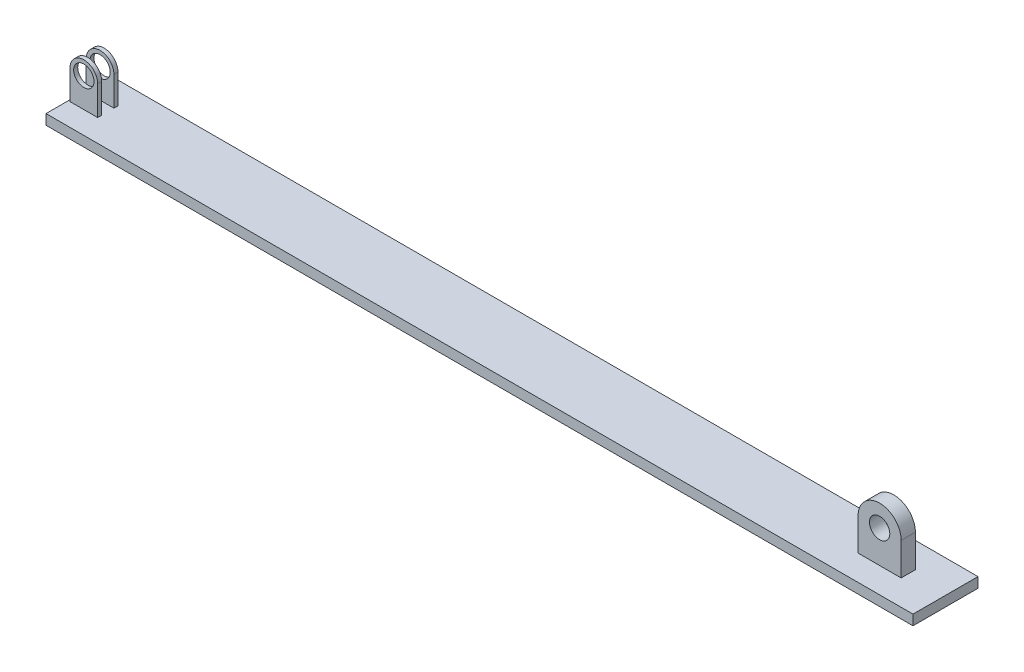
ISO-10303-21;
HEADER;
FILE_DESCRIPTION(('STEP AP214'),'2;1');
FILE_NAME('part.step','',(''),(''),'','','');
FILE_SCHEMA(('AUTOMOTIVE_DESIGN { 1 0 10303 214 1 1 1 1 }'));
ENDSEC;
DATA;
#1=APPLICATION_CONTEXT('core data for automotive mechanical design processes');
#2=APPLICATION_PROTOCOL_DEFINITION('international standard','automotive_design',2000,#1);
#3=PRODUCT_CONTEXT('',#1,'mechanical');
#4=PRODUCT('Part','Part','',(#3));
#5=PRODUCT_RELATED_PRODUCT_CATEGORY('part','',(#4));
#6=PRODUCT_DEFINITION_FORMATION('','',#4);
#7=PRODUCT_DEFINITION_CONTEXT('part definition',#1,'design');
#8=PRODUCT_DEFINITION('design','',#6,#7);
#9=PRODUCT_DEFINITION_SHAPE('','',#8);
#10=(LENGTH_UNIT() NAMED_UNIT(*) SI_UNIT(.MILLI.,.METRE.));
#11=(NAMED_UNIT(*) PLANE_ANGLE_UNIT() SI_UNIT($,.RADIAN.));
#12=(NAMED_UNIT(*) SI_UNIT($,.STERADIAN.) SOLID_ANGLE_UNIT());
#13=UNCERTAINTY_MEASURE_WITH_UNIT(LENGTH_MEASURE(1.E-05),#10,'distance_accuracy_value','');
#14=(GEOMETRIC_REPRESENTATION_CONTEXT(3) GLOBAL_UNCERTAINTY_ASSIGNED_CONTEXT((#13)) GLOBAL_UNIT_ASSIGNED_CONTEXT((#10,
#11,#12)) REPRESENTATION_CONTEXT('',''));
#15=CARTESIAN_POINT('',(0.,0.,0.));
#16=DIRECTION('',(0.,0.,1.));
#17=DIRECTION('',(1.,0.,0.));
#18=AXIS2_PLACEMENT_3D('',#15,#16,#17);
#19=CARTESIAN_POINT('',(0.,2.50000000000002,-16.));
#20=DIRECTION('',(0.,-1.,0.));
#21=DIRECTION('',(1.,0.,0.));
#22=AXIS2_PLACEMENT_3D('',#19,#20,#21);
#23=PLANE('',#22);
#24=DIRECTION('',(0.,0.,-1.));
#25=VECTOR('',#24,1.);
#26=CARTESIAN_POINT('',(14.4298921473095,2.50000000000002,5.));
#27=LINE('',#26,#25);
#28=CARTESIAN_POINT('',(14.4298921473095,2.50000000000002,5.));
#29=VERTEX_POINT('',#28);
#30=CARTESIAN_POINT('',(14.4298921473095,2.50000000000002,3.));
#31=VERTEX_POINT('',#30);
#32=EDGE_CURVE('E250',#29,#31,#27,.T.);
#33=ORIENTED_EDGE('',*,*,#32,.F.);
#34=DIRECTION('',(1.,0.,0.));
#35=VECTOR('',#34,1.);
#36=CARTESIAN_POINT('',(0.803073324079967,2.50000000000002,5.));
#37=LINE('',#36,#35);
#38=CARTESIAN_POINT('',(0.803073324079967,2.50000000000002,5.));
#39=VERTEX_POINT('',#38);
#40=EDGE_CURVE('E216',#39,#29,#37,.T.);
#41=ORIENTED_EDGE('',*,*,#40,.F.);
#42=DIRECTION('',(0.,0.,-1.));
#43=VECTOR('',#42,1.);
#44=CARTESIAN_POINT('',(0.803073324079967,2.50000000000002,5.));
#45=LINE('',#44,#43);
#46=CARTESIAN_POINT('',(0.803073324079967,2.50000000000002,3.));
#47=VERTEX_POINT('',#46);
#48=EDGE_CURVE('E238',#39,#47,#45,.T.);
#49=ORIENTED_EDGE('',*,*,#48,.T.);
#50=DIRECTION('',(-1.,0.,0.));
#51=VECTOR('',#50,1.);
#52=CARTESIAN_POINT('',(55.8620648864741,2.50000000000002,3.));
#53=LINE('',#52,#51);
#54=EDGE_CURVE('E192',#31,#47,#53,.T.);
#55=ORIENTED_EDGE('',*,*,#54,.F.);
#56=EDGE_LOOP('',(#33,#41,#49,#55));
#57=FACE_BOUND('',#56,.T.);
#58=DIRECTION('',(1.,0.,0.));
#59=VECTOR('',#58,1.);
#60=CARTESIAN_POINT('',(0.,2.50000000000002,16.));
#61=LINE('',#60,#59);
#62=CARTESIAN_POINT('',(0.,2.50000000000002,16.));
#63=VERTEX_POINT('',#62);
#64=CARTESIAN_POINT('',(426.72,2.49999999999993,16.));
#65=VERTEX_POINT('',#64);
#66=EDGE_CURVE('E267',#63,#65,#61,.T.);
#67=ORIENTED_EDGE('',*,*,#66,.T.);
#68=DIRECTION('',(0.,0.,1.));
#69=VECTOR('',#68,1.);
#70=CARTESIAN_POINT('',(426.72,2.49999999999993,-16.));
#71=LINE('',#70,#69);
#72=CARTESIAN_POINT('',(426.72,2.49999999999993,-16.));
#73=VERTEX_POINT('',#72);
#74=EDGE_CURVE('E43',#73,#65,#71,.T.);
#75=ORIENTED_EDGE('',*,*,#74,.F.);
#76=DIRECTION('',(1.,0.,0.));
#77=VECTOR('',#76,1.);
#78=CARTESIAN_POINT('',(0.,2.50000000000002,-16.));
#79=LINE('',#78,#77);
#80=CARTESIAN_POINT('',(0.,2.50000000000002,-16.));
#81=VERTEX_POINT('',#80);
#82=EDGE_CURVE('E257',#81,#73,#79,.T.);
#83=ORIENTED_EDGE('',*,*,#82,.F.);
#84=DIRECTION('',(0.,0.,1.));
#85=VECTOR('',#84,1.);
#86=CARTESIAN_POINT('',(0.,2.50000000000002,-16.));
#87=LINE('',#86,#85);
#88=EDGE_CURVE('E11',#81,#63,#87,.T.);
#89=ORIENTED_EDGE('',*,*,#88,.T.);
#90=EDGE_LOOP('',(#67,#75,#83,#89));
#91=FACE_BOUND('',#90,.T.);
#92=CARTESIAN_POINT('',(14.4298921473095,2.50000000000002,-3.));
#93=VERTEX_POINT('',#92);
#94=CARTESIAN_POINT('',(14.4298921473095,2.50000000000002,-5.));
#95=VERTEX_POINT('',#94);
#96=EDGE_CURVE('E249',#93,#95,#27,.T.);
#97=ORIENTED_EDGE('',*,*,#96,.F.);
#98=DIRECTION('',(-1.,0.,0.));
#99=VECTOR('',#98,1.);
#100=CARTESIAN_POINT('',(55.8620648864741,2.50000000000002,-3.));
#101=LINE('',#100,#99);
#102=CARTESIAN_POINT('',(0.803073324079967,2.50000000000002,-3.));
#103=VERTEX_POINT('',#102);
#104=EDGE_CURVE('E199',#93,#103,#101,.T.);
#105=ORIENTED_EDGE('',*,*,#104,.T.);
#106=CARTESIAN_POINT('',(0.803073324079967,2.50000000000002,-5.));
#107=VERTEX_POINT('',#106);
#108=EDGE_CURVE('E227',#103,#107,#45,.T.);
#109=ORIENTED_EDGE('',*,*,#108,.T.);
#110=DIRECTION('',(1.,0.,0.));
#111=VECTOR('',#110,1.);
#112=CARTESIAN_POINT('',(0.803073324079967,2.50000000000002,-5.));
#113=LINE('',#112,#111);
#114=EDGE_CURVE('E213',#107,#95,#113,.T.);
#115=ORIENTED_EDGE('',*,*,#114,.T.);
#116=EDGE_LOOP('',(#97,#105,#109,#115));
#117=FACE_BOUND('',#116,.T.);
#118=DIRECTION('',(0.,0.,-1.));
#119=VECTOR('',#118,1.);
#120=CARTESIAN_POINT('',(408.398633307808,2.50000000000002,3.5));
#121=LINE('',#120,#119);
#122=CARTESIAN_POINT('',(408.398633307808,2.49999999999994,3.5));
#123=VERTEX_POINT('',#122);
#124=CARTESIAN_POINT('',(408.398633307808,2.49999999999994,-3.5));
#125=VERTEX_POINT('',#124);
#126=EDGE_CURVE('E51',#123,#125,#121,.T.);
#127=ORIENTED_EDGE('',*,*,#126,.F.);
#128=DIRECTION('',(1.,0.,0.));
#129=VECTOR('',#128,1.);
#130=CARTESIAN_POINT('',(387.212680742163,2.50000000000002,3.5));
#131=LINE('',#130,#129);
#132=CARTESIAN_POINT('',(387.212680742163,2.50000000000002,3.5));
#133=VERTEX_POINT('',#132);
#134=EDGE_CURVE('E157',#133,#123,#131,.T.);
#135=ORIENTED_EDGE('',*,*,#134,.F.);
#136=DIRECTION('',(0.,0.,-1.));
#137=VECTOR('',#136,1.);
#138=CARTESIAN_POINT('',(387.212680742163,2.50000000000002,3.5));
#139=LINE('',#138,#137);
#140=CARTESIAN_POINT('',(387.212680742163,2.49999999999994,-3.5));
#141=VERTEX_POINT('',#140);
#142=EDGE_CURVE('E173',#133,#141,#139,.T.);
#143=ORIENTED_EDGE('',*,*,#142,.T.);
#144=DIRECTION('',(1.,0.,0.));
#145=VECTOR('',#144,1.);
#146=CARTESIAN_POINT('',(387.212680742163,2.50000000000002,-3.5));
#147=LINE('',#146,#145);
#148=EDGE_CURVE('E56',#141,#125,#147,.T.);
#149=ORIENTED_EDGE('',*,*,#148,.T.);
#150=EDGE_LOOP('',(#127,#135,#143,#149));
#151=FACE_BOUND('',#150,.T.);
#152=ADVANCED_FACE('F34',(#57,#91,#117,#151),#23,.F.);
#153=CARTESIAN_POINT('',(14.4298921473095,2.50000000000002,5.));
#154=DIRECTION('',(-1.,0.,0.));
#155=DIRECTION('',(0.,0.,1.));
#156=AXIS2_PLACEMENT_3D('',#153,#154,#155);
#157=PLANE('',#156);
#158=DIRECTION('',(0.,0.,-1.));
#159=VECTOR('',#158,1.);
#160=CARTESIAN_POINT('',(14.4298921473095,16.9215035060392,5.));
#161=LINE('',#160,#159);
#162=CARTESIAN_POINT('',(14.4298921473095,16.9215035060392,-3.));
#163=VERTEX_POINT('',#162);
#164=CARTESIAN_POINT('',(14.4298921473095,16.9215035060392,-5.));
#165=VERTEX_POINT('',#164);
#166=EDGE_CURVE('E245',#163,#165,#161,.T.);
#167=ORIENTED_EDGE('',*,*,#166,.F.);
#168=DIRECTION('',(0.,1.,0.));
#169=VECTOR('',#168,1.);
#170=CARTESIAN_POINT('',(14.4298921473095,2.50000000000002,-3.));
#171=LINE('',#170,#169);
#172=EDGE_CURVE('E191',#93,#163,#171,.T.);
#173=ORIENTED_EDGE('',*,*,#172,.F.);
#174=ORIENTED_EDGE('',*,*,#96,.T.);
#175=DIRECTION('',(0.,1.,0.));
#176=VECTOR('',#175,1.);
#177=CARTESIAN_POINT('',(14.4298921473095,2.50000000000002,-5.));
#178=LINE('',#177,#176);
#179=EDGE_CURVE('E230',#95,#165,#178,.T.);
#180=ORIENTED_EDGE('',*,*,#179,.T.);
#181=EDGE_LOOP('',(#167,#173,#174,#180));
#182=FACE_BOUND('',#181,.T.);
#183=ADVANCED_FACE('F311',(#182),#157,.F.);
#184=CARTESIAN_POINT('',(7.61648273569473,16.9215035060392,5.));
#185=DIRECTION('',(0.,0.,-1.));
#186=DIRECTION('',(-1.,0.,0.));
#187=AXIS2_PLACEMENT_3D('',#184,#185,#186);
#188=CYLINDRICAL_SURFACE('',#187,6.81340941161476);
#189=DIRECTION('',(0.,0.,-1.));
#190=VECTOR('',#189,1.);
#191=CARTESIAN_POINT('',(0.803073324079967,16.9215035060392,5.));
#192=LINE('',#191,#190);
#193=CARTESIAN_POINT('',(0.803073324079967,16.9215035060392,-3.));
#194=VERTEX_POINT('',#193);
#195=CARTESIAN_POINT('',(0.803073324079967,16.9215035060392,-5.));
#196=VERTEX_POINT('',#195);
#197=EDGE_CURVE('E241',#194,#196,#192,.T.);
#198=ORIENTED_EDGE('',*,*,#197,.F.);
#199=CARTESIAN_POINT('',(7.61648273569473,16.9215035060392,-3.));
#200=DIRECTION('',(0.,0.,-1.));
#201=DIRECTION('',(0.,1.,0.));
#202=AXIS2_PLACEMENT_3D('',#199,#200,#201);
#203=CIRCLE('',#202,6.81340941161476);
#204=EDGE_CURVE('E205',#194,#163,#203,.T.);
#205=ORIENTED_EDGE('',*,*,#204,.T.);
#206=ORIENTED_EDGE('',*,*,#166,.T.);
#207=CARTESIAN_POINT('',(7.61648273569473,16.9215035060392,-5.));
#208=DIRECTION('',(0.,0.,1.));
#209=DIRECTION('',(-1.,0.,0.));
#210=AXIS2_PLACEMENT_3D('',#207,#208,#209);
#211=CIRCLE('',#210,6.81340941161476);
#212=EDGE_CURVE('E233',#165,#196,#211,.T.);
#213=ORIENTED_EDGE('',*,*,#212,.T.);
#214=EDGE_LOOP('',(#198,#205,#206,#213));
#215=FACE_BOUND('',#214,.T.);
#216=ADVANCED_FACE('F316',(#215),#188,.T.);
#217=CARTESIAN_POINT('',(0.803073324079967,2.50000000000002,5.));
#218=DIRECTION('',(1.,0.,0.));
#219=DIRECTION('',(0.,0.,-1.));
#220=AXIS2_PLACEMENT_3D('',#217,#218,#219);
#221=PLANE('',#220);
#222=ORIENTED_EDGE('',*,*,#108,.F.);
#223=DIRECTION('',(0.,-1.,0.));
#224=VECTOR('',#223,1.);
#225=CARTESIAN_POINT('',(0.803073324079967,2.50000000000002,-3.));
#226=LINE('',#225,#224);
#227=EDGE_CURVE('E188',#194,#103,#226,.T.);
#228=ORIENTED_EDGE('',*,*,#227,.F.);
#229=ORIENTED_EDGE('',*,*,#197,.T.);
#230=DIRECTION('',(0.,-1.,0.));
#231=VECTOR('',#230,1.);
#232=CARTESIAN_POINT('',(0.803073324079967,2.50000000000002,-5.));
#233=LINE('',#232,#231);
#234=EDGE_CURVE('E220',#196,#107,#233,.T.);
#235=ORIENTED_EDGE('',*,*,#234,.T.);
#236=EDGE_LOOP('',(#222,#228,#229,#235));
#237=FACE_BOUND('',#236,.T.);
#238=ADVANCED_FACE('F340',(#237),#221,.F.);
#239=CARTESIAN_POINT('',(7.61648273569473,16.9215035060392,5.));
#240=DIRECTION('',(0.,0.,-1.));
#241=DIRECTION('',(-1.,0.,0.));
#242=AXIS2_PLACEMENT_3D('',#239,#240,#241);
#243=CYLINDRICAL_SURFACE('',#242,5.);
#244=CARTESIAN_POINT('',(7.61648273569473,16.9215035060392,-3.));
#245=DIRECTION('',(0.,0.,-1.));
#246=DIRECTION('',(0.,1.,0.));
#247=AXIS2_PLACEMENT_3D('',#244,#245,#246);
#248=CIRCLE('',#247,5.);
#249=CARTESIAN_POINT('',(7.61648273569473,21.9215035060392,-3.));
#250=VERTEX_POINT('',#249);
#251=EDGE_CURVE('E38',#250,#250,#248,.T.);
#252=ORIENTED_EDGE('',*,*,#251,.F.);
#253=EDGE_LOOP('',(#252));
#254=FACE_BOUND('',#253,.T.);
#255=CARTESIAN_POINT('',(7.61648273569473,16.9215035060392,-5.));
#256=DIRECTION('',(0.,0.,1.));
#257=DIRECTION('',(1.,0.,0.));
#258=AXIS2_PLACEMENT_3D('',#255,#256,#257);
#259=CIRCLE('',#258,5.);
#260=CARTESIAN_POINT('',(12.6164827356947,16.9215035060392,-5.));
#261=VERTEX_POINT('',#260);
#262=EDGE_CURVE('E208',#261,#261,#259,.T.);
#263=ORIENTED_EDGE('',*,*,#262,.F.);
#264=EDGE_LOOP('',(#263));
#265=FACE_BOUND('',#264,.T.);
#266=ADVANCED_FACE('F291',(#254,#265),#243,.F.);
#267=CARTESIAN_POINT('',(0.,-2.49999999999998,-16.));
#268=DIRECTION('',(1.,0.,0.));
#269=DIRECTION('',(0.,1.,0.));
#270=AXIS2_PLACEMENT_3D('',#267,#268,#269);
#271=PLANE('',#270);
#272=DIRECTION('',(0.,1.,0.));
#273=VECTOR('',#272,1.);
#274=CARTESIAN_POINT('',(0.,-2.49999999999998,16.));
#275=LINE('',#274,#273);
#276=CARTESIAN_POINT('',(0.,-2.49999999999998,16.));
#277=VERTEX_POINT('',#276);
#278=EDGE_CURVE('E253',#277,#63,#275,.T.);
#279=ORIENTED_EDGE('',*,*,#278,.T.);
#280=ORIENTED_EDGE('',*,*,#88,.F.);
#281=DIRECTION('',(0.,1.,0.));
#282=VECTOR('',#281,1.);
#283=CARTESIAN_POINT('',(0.,-2.49999999999998,-16.));
#284=LINE('',#283,#282);
#285=CARTESIAN_POINT('',(0.,-2.49999999999998,-16.));
#286=VERTEX_POINT('',#285);
#287=EDGE_CURVE('E254',#286,#81,#284,.T.);
#288=ORIENTED_EDGE('',*,*,#287,.F.);
#289=DIRECTION('',(0.,0.,1.));
#290=VECTOR('',#289,1.);
#291=CARTESIAN_POINT('',(0.,-2.49999999999998,-16.));
#292=LINE('',#291,#290);
#293=EDGE_CURVE('E264',#286,#277,#292,.T.);
#294=ORIENTED_EDGE('',*,*,#293,.T.);
#295=EDGE_LOOP('',(#279,#280,#288,#294));
#296=FACE_BOUND('',#295,.T.);
#297=ADVANCED_FACE('F36',(#296),#271,.F.);
#298=CARTESIAN_POINT('',(426.72,-2.49999999999996,-16.));
#299=DIRECTION('',(-1.,0.,0.));
#300=DIRECTION('',(0.,0.,1.));
#301=AXIS2_PLACEMENT_3D('',#298,#299,#300);
#302=PLANE('',#301);
#303=DIRECTION('',(0.,-1.,0.));
#304=VECTOR('',#303,1.);
#305=CARTESIAN_POINT('',(426.72,-2.49999999999996,16.));
#306=LINE('',#305,#304);
#307=CARTESIAN_POINT('',(426.72,-2.49999999999996,16.));
#308=VERTEX_POINT('',#307);
#309=EDGE_CURVE('E270',#65,#308,#306,.T.);
#310=ORIENTED_EDGE('',*,*,#309,.T.);
#311=DIRECTION('',(0.,0.,1.));
#312=VECTOR('',#311,1.);
#313=CARTESIAN_POINT('',(426.72,-2.49999999999996,-16.));
#314=LINE('',#313,#312);
#315=CARTESIAN_POINT('',(426.72,-2.49999999999996,-16.));
#316=VERTEX_POINT('',#315);
#317=EDGE_CURVE('E275',#316,#308,#314,.T.);
#318=ORIENTED_EDGE('',*,*,#317,.F.);
#319=DIRECTION('',(0.,-1.,0.));
#320=VECTOR('',#319,1.);
#321=CARTESIAN_POINT('',(426.72,-2.49999999999996,-16.));
#322=LINE('',#321,#320);
#323=EDGE_CURVE('E260',#73,#316,#322,.T.);
#324=ORIENTED_EDGE('',*,*,#323,.F.);
#325=ORIENTED_EDGE('',*,*,#74,.T.);
#326=EDGE_LOOP('',(#310,#318,#324,#325));
#327=FACE_BOUND('',#326,.T.);
#328=ADVANCED_FACE('F321',(#327),#302,.F.);
#329=CARTESIAN_POINT('',(0.,-2.49999999999998,-16.));
#330=DIRECTION('',(0.,1.,0.));
#331=DIRECTION('',(-1.,0.,0.));
#332=AXIS2_PLACEMENT_3D('',#329,#330,#331);
#333=PLANE('',#332);
#334=DIRECTION('',(-1.,0.,0.));
#335=VECTOR('',#334,1.);
#336=CARTESIAN_POINT('',(0.,-2.49999999999998,16.));
#337=LINE('',#336,#335);
#338=EDGE_CURVE('E258',#308,#277,#337,.T.);
#339=ORIENTED_EDGE('',*,*,#338,.T.);
#340=ORIENTED_EDGE('',*,*,#293,.F.);
#341=DIRECTION('',(-1.,0.,0.));
#342=VECTOR('',#341,1.);
#343=CARTESIAN_POINT('',(0.,-2.49999999999998,-16.));
#344=LINE('',#343,#342);
#345=EDGE_CURVE('E262',#316,#286,#344,.T.);
#346=ORIENTED_EDGE('',*,*,#345,.F.);
#347=ORIENTED_EDGE('',*,*,#317,.T.);
#348=EDGE_LOOP('',(#339,#340,#346,#347));
#349=FACE_BOUND('',#348,.T.);
#350=ADVANCED_FACE('F324',(#349),#333,.F.);
#351=CARTESIAN_POINT('',(0.,2.50000000000002,-16.));
#352=DIRECTION('',(0.,0.,-1.));
#353=DIRECTION('',(-1.,0.,0.));
#354=AXIS2_PLACEMENT_3D('',#351,#352,#353);
#355=PLANE('',#354);
#356=ORIENTED_EDGE('',*,*,#287,.T.);
#357=ORIENTED_EDGE('',*,*,#82,.T.);
#358=ORIENTED_EDGE('',*,*,#323,.T.);
#359=ORIENTED_EDGE('',*,*,#345,.T.);
#360=EDGE_LOOP('',(#356,#357,#358,#359));
#361=FACE_BOUND('',#360,.T.);
#362=ADVANCED_FACE('F307',(#361),#355,.T.);
#363=CARTESIAN_POINT('',(0.,2.50000000000002,16.));
#364=DIRECTION('',(0.,0.,-1.));
#365=DIRECTION('',(-1.,0.,0.));
#366=AXIS2_PLACEMENT_3D('',#363,#364,#365);
#367=PLANE('',#366);
#368=ORIENTED_EDGE('',*,*,#278,.F.);
#369=ORIENTED_EDGE('',*,*,#338,.F.);
#370=ORIENTED_EDGE('',*,*,#309,.F.);
#371=ORIENTED_EDGE('',*,*,#66,.F.);
#372=EDGE_LOOP('',(#368,#369,#370,#371));
#373=FACE_BOUND('',#372,.T.);
#374=ADVANCED_FACE('F297',(#373),#367,.F.);
#375=CARTESIAN_POINT('',(7.61648273569473,16.9215035060392,5.));
#376=DIRECTION('',(0.,0.,-1.));
#377=DIRECTION('',(-1.,0.,0.));
#378=AXIS2_PLACEMENT_3D('',#375,#376,#377);
#379=PLANE('',#378);
#380=ORIENTED_EDGE('',*,*,#40,.T.);
#381=DIRECTION('',(0.,1.,0.));
#382=VECTOR('',#381,1.);
#383=CARTESIAN_POINT('',(14.4298921473095,2.50000000000002,5.));
#384=LINE('',#383,#382);
#385=CARTESIAN_POINT('',(14.4298921473095,16.9215035060392,5.));
#386=VERTEX_POINT('',#385);
#387=EDGE_CURVE('E219',#29,#386,#384,.T.);
#388=ORIENTED_EDGE('',*,*,#387,.T.);
#389=CARTESIAN_POINT('',(7.61648273569473,16.9215035060392,5.));
#390=DIRECTION('',(0.,0.,1.));
#391=DIRECTION('',(-1.,0.,0.));
#392=AXIS2_PLACEMENT_3D('',#389,#390,#391);
#393=CIRCLE('',#392,6.81340941161476);
#394=CARTESIAN_POINT('',(0.803073324079967,16.9215035060392,5.));
#395=VERTEX_POINT('',#394);
#396=EDGE_CURVE('E222',#386,#395,#393,.T.);
#397=ORIENTED_EDGE('',*,*,#396,.T.);
#398=DIRECTION('',(0.,-1.,0.));
#399=VECTOR('',#398,1.);
#400=CARTESIAN_POINT('',(0.803073324079967,2.50000000000002,5.));
#401=LINE('',#400,#399);
#402=EDGE_CURVE('E224',#395,#39,#401,.T.);
#403=ORIENTED_EDGE('',*,*,#402,.T.);
#404=EDGE_LOOP('',(#380,#388,#397,#403));
#405=FACE_BOUND('',#404,.T.);
#406=CARTESIAN_POINT('',(7.61648273569473,16.9215035060392,5.));
#407=DIRECTION('',(0.,0.,1.));
#408=DIRECTION('',(1.,0.,0.));
#409=AXIS2_PLACEMENT_3D('',#406,#407,#408);
#410=CIRCLE('',#409,5.);
#411=CARTESIAN_POINT('',(12.6164827356947,16.9215035060392,5.));
#412=VERTEX_POINT('',#411);
#413=EDGE_CURVE('E209',#412,#412,#410,.T.);
#414=ORIENTED_EDGE('',*,*,#413,.F.);
#415=EDGE_LOOP('',(#414));
#416=FACE_BOUND('',#415,.T.);
#417=ADVANCED_FACE('F294',(#405,#416),#379,.F.);
#418=CARTESIAN_POINT('',(7.61648273569473,16.9215035060392,-5.));
#419=DIRECTION('',(0.,0.,-1.));
#420=DIRECTION('',(-1.,0.,0.));
#421=AXIS2_PLACEMENT_3D('',#418,#419,#420);
#422=PLANE('',#421);
#423=ORIENTED_EDGE('',*,*,#114,.F.);
#424=ORIENTED_EDGE('',*,*,#234,.F.);
#425=ORIENTED_EDGE('',*,*,#212,.F.);
#426=ORIENTED_EDGE('',*,*,#179,.F.);
#427=EDGE_LOOP('',(#423,#424,#425,#426));
#428=FACE_BOUND('',#427,.T.);
#429=ORIENTED_EDGE('',*,*,#262,.T.);
#430=EDGE_LOOP('',(#429));
#431=FACE_BOUND('',#430,.T.);
#432=ADVANCED_FACE('F296',(#428,#431),#422,.T.);
#433=ORIENTED_EDGE('',*,*,#32,.T.);
#434=DIRECTION('',(0.,-1.,0.));
#435=VECTOR('',#434,1.);
#436=CARTESIAN_POINT('',(14.4298921473095,2.50000000000002,3.));
#437=LINE('',#436,#435);
#438=CARTESIAN_POINT('',(14.4298921473095,16.9215035060392,3.));
#439=VERTEX_POINT('',#438);
#440=EDGE_CURVE('E189',#439,#31,#437,.T.);
#441=ORIENTED_EDGE('',*,*,#440,.F.);
#442=EDGE_CURVE('E246',#386,#439,#161,.T.);
#443=ORIENTED_EDGE('',*,*,#442,.F.);
#444=ORIENTED_EDGE('',*,*,#387,.F.);
#445=EDGE_LOOP('',(#433,#441,#443,#444));
#446=FACE_BOUND('',#445,.T.);
#447=ADVANCED_FACE('F304',(#446),#157,.F.);
#448=ORIENTED_EDGE('',*,*,#442,.T.);
#449=CARTESIAN_POINT('',(7.61648273569473,16.9215035060392,3.));
#450=DIRECTION('',(0.,0.,1.));
#451=DIRECTION('',(0.,-1.,0.));
#452=AXIS2_PLACEMENT_3D('',#449,#450,#451);
#453=CIRCLE('',#452,6.81340941161476);
#454=CARTESIAN_POINT('',(0.803073324079967,16.9215035060392,3.));
#455=VERTEX_POINT('',#454);
#456=EDGE_CURVE('E202',#439,#455,#453,.T.);
#457=ORIENTED_EDGE('',*,*,#456,.T.);
#458=EDGE_CURVE('E242',#395,#455,#192,.T.);
#459=ORIENTED_EDGE('',*,*,#458,.F.);
#460=ORIENTED_EDGE('',*,*,#396,.F.);
#461=EDGE_LOOP('',(#448,#457,#459,#460));
#462=FACE_BOUND('',#461,.T.);
#463=ADVANCED_FACE('F333',(#462),#188,.T.);
#464=ORIENTED_EDGE('',*,*,#458,.T.);
#465=DIRECTION('',(0.,1.,0.));
#466=VECTOR('',#465,1.);
#467=CARTESIAN_POINT('',(0.803073324079967,2.50000000000002,3.));
#468=LINE('',#467,#466);
#469=EDGE_CURVE('E197',#47,#455,#468,.T.);
#470=ORIENTED_EDGE('',*,*,#469,.F.);
#471=ORIENTED_EDGE('',*,*,#48,.F.);
#472=ORIENTED_EDGE('',*,*,#402,.F.);
#473=EDGE_LOOP('',(#464,#470,#471,#472));
#474=FACE_BOUND('',#473,.T.);
#475=ADVANCED_FACE('F289',(#474),#221,.F.);
#476=CARTESIAN_POINT('',(7.61648273569473,16.9215035060392,3.));
#477=DIRECTION('',(0.,0.,1.));
#478=DIRECTION('',(0.,-1.,0.));
#479=AXIS2_PLACEMENT_3D('',#476,#477,#478);
#480=CIRCLE('',#479,5.);
#481=CARTESIAN_POINT('',(7.61648273569473,11.9215035060392,3.));
#482=VERTEX_POINT('',#481);
#483=EDGE_CURVE('E194',#482,#482,#480,.T.);
#484=ORIENTED_EDGE('',*,*,#483,.F.);
#485=EDGE_LOOP('',(#484));
#486=FACE_BOUND('',#485,.T.);
#487=ORIENTED_EDGE('',*,*,#413,.T.);
#488=EDGE_LOOP('',(#487));
#489=FACE_BOUND('',#488,.T.);
#490=ADVANCED_FACE('F285',(#486,#489),#243,.F.);
#491=CARTESIAN_POINT('',(55.8620648864741,2.50000000000002,-3.));
#492=DIRECTION('',(0.,0.,-1.));
#493=DIRECTION('',(0.,1.,0.));
#494=AXIS2_PLACEMENT_3D('',#491,#492,#493);
#495=PLANE('',#494);
#496=ORIENTED_EDGE('',*,*,#251,.T.);
#497=EDGE_LOOP('',(#496));
#498=FACE_BOUND('',#497,.T.);
#499=ORIENTED_EDGE('',*,*,#227,.T.);
#500=ORIENTED_EDGE('',*,*,#104,.F.);
#501=ORIENTED_EDGE('',*,*,#172,.T.);
#502=ORIENTED_EDGE('',*,*,#204,.F.);
#503=EDGE_LOOP('',(#499,#500,#501,#502));
#504=FACE_BOUND('',#503,.T.);
#505=ADVANCED_FACE('F288',(#498,#504),#495,.F.);
#506=CARTESIAN_POINT('',(55.8620648864741,2.50000000000002,3.));
#507=DIRECTION('',(0.,0.,1.));
#508=DIRECTION('',(0.,-1.,0.));
#509=AXIS2_PLACEMENT_3D('',#506,#507,#508);
#510=PLANE('',#509);
#511=ORIENTED_EDGE('',*,*,#483,.T.);
#512=EDGE_LOOP('',(#511));
#513=FACE_BOUND('',#512,.T.);
#514=ORIENTED_EDGE('',*,*,#440,.T.);
#515=ORIENTED_EDGE('',*,*,#54,.T.);
#516=ORIENTED_EDGE('',*,*,#469,.T.);
#517=ORIENTED_EDGE('',*,*,#456,.F.);
#518=EDGE_LOOP('',(#514,#515,#516,#517));
#519=FACE_BOUND('',#518,.T.);
#520=ADVANCED_FACE('F282',(#513,#519),#510,.F.);
#521=CARTESIAN_POINT('',(397.805657024986,18.5157466895125,3.5));
#522=DIRECTION('',(0.,0.,1.));
#523=DIRECTION('',(1.,0.,0.));
#524=AXIS2_PLACEMENT_3D('',#521,#522,#523);
#525=PLANE('',#524);
#526=ORIENTED_EDGE('',*,*,#134,.T.);
#527=DIRECTION('',(0.,1.,0.));
#528=VECTOR('',#527,1.);
#529=CARTESIAN_POINT('',(408.398633307808,2.50000000000002,3.5));
#530=LINE('',#529,#528);
#531=CARTESIAN_POINT('',(408.398633307808,18.5157466895125,3.5));
#532=VERTEX_POINT('',#531);
#533=EDGE_CURVE('E149',#123,#532,#530,.T.);
#534=ORIENTED_EDGE('',*,*,#533,.T.);
#535=CARTESIAN_POINT('',(397.805657024986,18.5157466895125,3.5));
#536=DIRECTION('',(0.,0.,1.));
#537=DIRECTION('',(1.,0.,0.));
#538=AXIS2_PLACEMENT_3D('',#535,#536,#537);
#539=CIRCLE('',#538,10.5929762828229);
#540=CARTESIAN_POINT('',(387.212680742163,18.5157466895125,3.5));
#541=VERTEX_POINT('',#540);
#542=EDGE_CURVE('E155',#532,#541,#539,.T.);
#543=ORIENTED_EDGE('',*,*,#542,.T.);
#544=DIRECTION('',(0.,-1.,0.));
#545=VECTOR('',#544,1.);
#546=CARTESIAN_POINT('',(387.212680742163,2.50000000000002,3.5));
#547=LINE('',#546,#545);
#548=EDGE_CURVE('E171',#541,#133,#547,.T.);
#549=ORIENTED_EDGE('',*,*,#548,.T.);
#550=EDGE_LOOP('',(#526,#534,#543,#549));
#551=FACE_BOUND('',#550,.T.);
#552=CARTESIAN_POINT('',(397.805657024986,18.5157466895125,3.5));
#553=DIRECTION('',(0.,0.,1.));
#554=DIRECTION('',(1.,0.,0.));
#555=AXIS2_PLACEMENT_3D('',#552,#553,#554);
#556=CIRCLE('',#555,4.99999999999999);
#557=CARTESIAN_POINT('',(402.805657024986,18.5157466895125,3.5));
#558=VERTEX_POINT('',#557);
#559=EDGE_CURVE('E178',#558,#558,#556,.T.);
#560=ORIENTED_EDGE('',*,*,#559,.F.);
#561=EDGE_LOOP('',(#560));
#562=FACE_BOUND('',#561,.T.);
#563=ADVANCED_FACE('F151',(#551,#562),#525,.T.);
#564=CARTESIAN_POINT('',(397.805657024986,18.5157466895125,-3.5));
#565=DIRECTION('',(0.,0.,1.));
#566=DIRECTION('',(1.,0.,0.));
#567=AXIS2_PLACEMENT_3D('',#564,#565,#566);
#568=PLANE('',#567);
#569=ORIENTED_EDGE('',*,*,#148,.F.);
#570=DIRECTION('',(0.,-1.,0.));
#571=VECTOR('',#570,1.);
#572=CARTESIAN_POINT('',(387.212680742163,2.50000000000002,-3.5));
#573=LINE('',#572,#571);
#574=CARTESIAN_POINT('',(387.212680742163,18.5157466895125,-3.5));
#575=VERTEX_POINT('',#574);
#576=EDGE_CURVE('E182',#575,#141,#573,.T.);
#577=ORIENTED_EDGE('',*,*,#576,.F.);
#578=CARTESIAN_POINT('',(397.805657024986,18.5157466895125,-3.5));
#579=DIRECTION('',(0.,0.,1.));
#580=DIRECTION('',(1.,0.,0.));
#581=AXIS2_PLACEMENT_3D('',#578,#579,#580);
#582=CIRCLE('',#581,10.5929762828229);
#583=CARTESIAN_POINT('',(408.398633307808,18.5157466895125,-3.5));
#584=VERTEX_POINT('',#583);
#585=EDGE_CURVE('E180',#584,#575,#582,.T.);
#586=ORIENTED_EDGE('',*,*,#585,.F.);
#587=DIRECTION('',(0.,1.,0.));
#588=VECTOR('',#587,1.);
#589=CARTESIAN_POINT('',(408.398633307808,2.50000000000002,-3.5));
#590=LINE('',#589,#588);
#591=EDGE_CURVE('E163',#125,#584,#590,.T.);
#592=ORIENTED_EDGE('',*,*,#591,.F.);
#593=EDGE_LOOP('',(#569,#577,#586,#592));
#594=FACE_BOUND('',#593,.T.);
#595=CARTESIAN_POINT('',(397.805657024986,18.5157466895125,-3.5));
#596=DIRECTION('',(0.,0.,1.));
#597=DIRECTION('',(1.,0.,0.));
#598=AXIS2_PLACEMENT_3D('',#595,#596,#597);
#599=CIRCLE('',#598,4.99999999999999);
#600=CARTESIAN_POINT('',(402.805657024986,18.5157466895125,-3.5));
#601=VERTEX_POINT('',#600);
#602=EDGE_CURVE('E399',#601,#601,#599,.T.);
#603=ORIENTED_EDGE('',*,*,#602,.T.);
#604=EDGE_LOOP('',(#603));
#605=FACE_BOUND('',#604,.T.);
#606=ADVANCED_FACE('F377',(#594,#605),#568,.F.);
#607=CARTESIAN_POINT('',(408.398633307808,2.50000000000002,3.5));
#608=DIRECTION('',(-1.,0.,0.));
#609=DIRECTION('',(0.,0.,1.));
#610=AXIS2_PLACEMENT_3D('',#607,#608,#609);
#611=PLANE('',#610);
#612=ORIENTED_EDGE('',*,*,#591,.T.);
#613=DIRECTION('',(0.,0.,-1.));
#614=VECTOR('',#613,1.);
#615=CARTESIAN_POINT('',(408.398633307808,18.5157466895125,3.5));
#616=LINE('',#615,#614);
#617=EDGE_CURVE('E161',#532,#584,#616,.T.);
#618=ORIENTED_EDGE('',*,*,#617,.F.);
#619=ORIENTED_EDGE('',*,*,#533,.F.);
#620=ORIENTED_EDGE('',*,*,#126,.T.);
#621=EDGE_LOOP('',(#612,#618,#619,#620));
#622=FACE_BOUND('',#621,.T.);
#623=ADVANCED_FACE('F162',(#622),#611,.F.);
#624=CARTESIAN_POINT('',(397.805657024986,18.5157466895125,3.5));
#625=DIRECTION('',(0.,0.,-1.));
#626=DIRECTION('',(-1.,0.,0.));
#627=AXIS2_PLACEMENT_3D('',#624,#625,#626);
#628=CYLINDRICAL_SURFACE('',#627,10.5929762828229);
#629=ORIENTED_EDGE('',*,*,#585,.T.);
#630=DIRECTION('',(0.,0.,-1.));
#631=VECTOR('',#630,1.);
#632=CARTESIAN_POINT('',(387.212680742163,18.5157466895125,3.5));
#633=LINE('',#632,#631);
#634=EDGE_CURVE('E166',#541,#575,#633,.T.);
#635=ORIENTED_EDGE('',*,*,#634,.F.);
#636=ORIENTED_EDGE('',*,*,#542,.F.);
#637=ORIENTED_EDGE('',*,*,#617,.T.);
#638=EDGE_LOOP('',(#629,#635,#636,#637));
#639=FACE_BOUND('',#638,.T.);
#640=ADVANCED_FACE('F168',(#639),#628,.T.);
#641=CARTESIAN_POINT('',(387.212680742163,2.50000000000002,3.5));
#642=DIRECTION('',(1.,0.,0.));
#643=DIRECTION('',(0.,0.,-1.));
#644=AXIS2_PLACEMENT_3D('',#641,#642,#643);
#645=PLANE('',#644);
#646=ORIENTED_EDGE('',*,*,#576,.T.);
#647=ORIENTED_EDGE('',*,*,#142,.F.);
#648=ORIENTED_EDGE('',*,*,#548,.F.);
#649=ORIENTED_EDGE('',*,*,#634,.T.);
#650=EDGE_LOOP('',(#646,#647,#648,#649));
#651=FACE_BOUND('',#650,.T.);
#652=ADVANCED_FACE('F380',(#651),#645,.F.);
#653=CARTESIAN_POINT('',(397.805657024986,18.5157466895125,3.5));
#654=DIRECTION('',(0.,0.,-1.));
#655=DIRECTION('',(-1.,0.,0.));
#656=AXIS2_PLACEMENT_3D('',#653,#654,#655);
#657=CYLINDRICAL_SURFACE('',#656,4.99999999999999);
#658=ORIENTED_EDGE('',*,*,#559,.T.);
#659=EDGE_LOOP('',(#658));
#660=FACE_BOUND('',#659,.T.);
#661=ORIENTED_EDGE('',*,*,#602,.F.);
#662=EDGE_LOOP('',(#661));
#663=FACE_BOUND('',#662,.T.);
#664=ADVANCED_FACE('F383',(#660,#663),#657,.F.);
#665=CLOSED_SHELL('',(#152,#183,#216,#238,#266,#297,#328,#350,#362,#374,#417,#432,#447,#463,
#475,#490,#505,#520,#563,#606,#623,#640,#652,#664));
#666=MANIFOLD_SOLID_BREP('B2',#665);
#667=ADVANCED_BREP_SHAPE_REPRESENTATION('',(#18,#666),#14);
#668=SHAPE_DEFINITION_REPRESENTATION(#9,#667);
ENDSEC;
END-ISO-10303-21;
